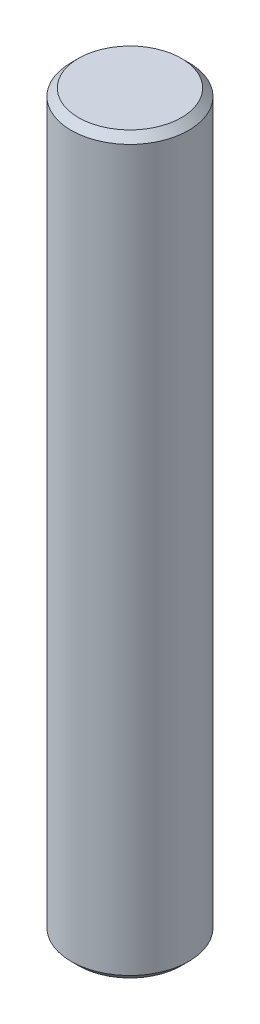
ISO-10303-21;
HEADER;
FILE_DESCRIPTION(('STEP AP214'),'2;1');
FILE_NAME('part.step','',(''),(''),'','','');
FILE_SCHEMA(('AUTOMOTIVE_DESIGN { 1 0 10303 214 1 1 1 1 }'));
ENDSEC;
DATA;
#1=APPLICATION_CONTEXT('core data for automotive mechanical design processes');
#2=APPLICATION_PROTOCOL_DEFINITION('international standard','automotive_design',2000,#1);
#3=PRODUCT_CONTEXT('',#1,'mechanical');
#4=PRODUCT('Part','Part','',(#3));
#5=PRODUCT_RELATED_PRODUCT_CATEGORY('part','',(#4));
#6=PRODUCT_DEFINITION_FORMATION('','',#4);
#7=PRODUCT_DEFINITION_CONTEXT('part definition',#1,'design');
#8=PRODUCT_DEFINITION('design','',#6,#7);
#9=PRODUCT_DEFINITION_SHAPE('','',#8);
#10=(LENGTH_UNIT() NAMED_UNIT(*) SI_UNIT(.MILLI.,.METRE.));
#11=(NAMED_UNIT(*) PLANE_ANGLE_UNIT() SI_UNIT($,.RADIAN.));
#12=(NAMED_UNIT(*) SI_UNIT($,.STERADIAN.) SOLID_ANGLE_UNIT());
#13=UNCERTAINTY_MEASURE_WITH_UNIT(LENGTH_MEASURE(1.E-05),#10,'distance_accuracy_value','');
#14=(GEOMETRIC_REPRESENTATION_CONTEXT(3) GLOBAL_UNCERTAINTY_ASSIGNED_CONTEXT((#13)) GLOBAL_UNIT_ASSIGNED_CONTEXT((#10,
#11,#12)) REPRESENTATION_CONTEXT('',''));
#15=CARTESIAN_POINT('',(0.,0.,0.));
#16=DIRECTION('',(0.,0.,1.));
#17=DIRECTION('',(1.,0.,0.));
#18=AXIS2_PLACEMENT_3D('',#15,#16,#17);
#19=CARTESIAN_POINT('',(0.,100.,0.));
#20=DIRECTION('',(0.,-1.,0.));
#21=DIRECTION('',(0.,0.,-1.));
#22=AXIS2_PLACEMENT_3D('',#19,#20,#21);
#23=CYLINDRICAL_SURFACE('',#22,8.);
#24=CARTESIAN_POINT('',(0.,0.999999999999987,0.));
#25=DIRECTION('',(0.,1.,0.));
#26=DIRECTION('',(0.,0.,1.));
#27=AXIS2_PLACEMENT_3D('',#24,#25,#26);
#28=CIRCLE('',#27,8.);
#29=CARTESIAN_POINT('',(0.,0.999999999999987,8.));
#30=VERTEX_POINT('',#29);
#31=EDGE_CURVE('E41',#30,#30,#28,.T.);
#32=ORIENTED_EDGE('',*,*,#31,.T.);
#33=EDGE_LOOP('',(#32));
#34=FACE_BOUND('',#33,.T.);
#35=CARTESIAN_POINT('',(0.,99.,0.));
#36=DIRECTION('',(0.,1.,0.));
#37=DIRECTION('',(0.,0.,1.));
#38=AXIS2_PLACEMENT_3D('',#35,#36,#37);
#39=CIRCLE('',#38,8.);
#40=CARTESIAN_POINT('',(0.,99.,8.));
#41=VERTEX_POINT('',#40);
#42=EDGE_CURVE('E45',#41,#41,#39,.F.);
#43=ORIENTED_EDGE('',*,*,#42,.T.);
#44=EDGE_LOOP('',(#43));
#45=FACE_BOUND('',#44,.T.);
#46=ADVANCED_FACE('F30',(#34,#45),#23,.T.);
#47=CARTESIAN_POINT('',(0.,100.,0.));
#48=DIRECTION('',(0.,1.,0.));
#49=DIRECTION('',(0.,0.,1.));
#50=AXIS2_PLACEMENT_3D('',#47,#48,#49);
#51=PLANE('',#50);
#52=CARTESIAN_POINT('',(0.,100.,0.));
#53=DIRECTION('',(0.,1.,0.));
#54=DIRECTION('',(0.,0.,1.));
#55=AXIS2_PLACEMENT_3D('',#52,#53,#54);
#56=CIRCLE('',#55,7.00000000000001);
#57=CARTESIAN_POINT('',(0.,100.,7.00000000000001));
#58=VERTEX_POINT('',#57);
#59=EDGE_CURVE('E10',#58,#58,#56,.T.);
#60=ORIENTED_EDGE('',*,*,#59,.T.);
#61=EDGE_LOOP('',(#60));
#62=FACE_BOUND('',#61,.T.);
#63=ADVANCED_FACE('F61',(#62),#51,.T.);
#64=CARTESIAN_POINT('',(0.,0.,0.));
#65=DIRECTION('',(0.,1.,0.));
#66=DIRECTION('',(0.,0.,1.));
#67=AXIS2_PLACEMENT_3D('',#64,#65,#66);
#68=PLANE('',#67);
#69=CARTESIAN_POINT('',(0.,0.,0.));
#70=DIRECTION('',(0.,1.,0.));
#71=DIRECTION('',(0.,0.,1.));
#72=AXIS2_PLACEMENT_3D('',#69,#70,#71);
#73=CIRCLE('',#72,7.00000000000001);
#74=CARTESIAN_POINT('',(0.,0.,7.00000000000001));
#75=VERTEX_POINT('',#74);
#76=EDGE_CURVE('E37',#75,#75,#73,.F.);
#77=ORIENTED_EDGE('',*,*,#76,.T.);
#78=EDGE_LOOP('',(#77));
#79=FACE_BOUND('',#78,.T.);
#80=ADVANCED_FACE('F58',(#79),#68,.F.);
#81=CARTESIAN_POINT('',(0.,0.999999999999987,0.));
#82=DIRECTION('',(0.,1.,0.));
#83=DIRECTION('',(0.,0.,1.));
#84=AXIS2_PLACEMENT_3D('',#81,#82,#83);
#85=CONICAL_SURFACE('',#84,8.,0.785398163397452);
#86=ORIENTED_EDGE('',*,*,#76,.F.);
#87=EDGE_LOOP('',(#86));
#88=FACE_BOUND('',#87,.T.);
#89=ORIENTED_EDGE('',*,*,#31,.F.);
#90=EDGE_LOOP('',(#89));
#91=FACE_BOUND('',#90,.T.);
#92=ADVANCED_FACE('F54',(#88,#91),#85,.T.);
#93=CARTESIAN_POINT('',(0.,100.,0.));
#94=DIRECTION('',(0.,-1.,0.));
#95=DIRECTION('',(0.,0.,-1.));
#96=AXIS2_PLACEMENT_3D('',#93,#94,#95);
#97=CONICAL_SURFACE('',#96,7.00000000000001,0.785398163397445);
#98=ORIENTED_EDGE('',*,*,#42,.F.);
#99=EDGE_LOOP('',(#98));
#100=FACE_BOUND('',#99,.T.);
#101=ORIENTED_EDGE('',*,*,#59,.F.);
#102=EDGE_LOOP('',(#101));
#103=FACE_BOUND('',#102,.T.);
#104=ADVANCED_FACE('F32',(#100,#103),#97,.T.);
#105=CLOSED_SHELL('',(#46,#63,#80,#92,#104));
#106=MANIFOLD_SOLID_BREP('B2',#105);
#107=ADVANCED_BREP_SHAPE_REPRESENTATION('',(#18,#106),#14);
#108=SHAPE_DEFINITION_REPRESENTATION(#9,#107);
ENDSEC;
END-ISO-10303-21;
